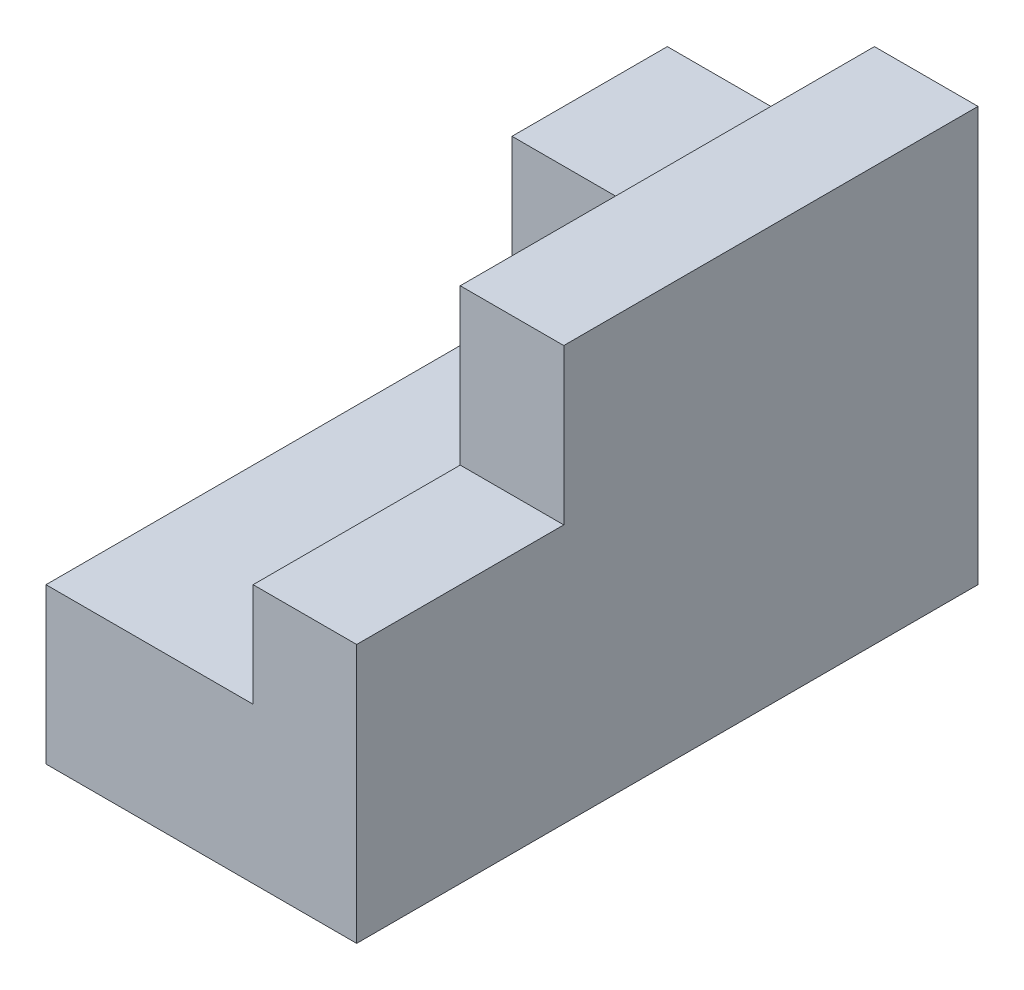
ISO-10303-21;
HEADER;
FILE_DESCRIPTION(('STEP AP214'),'2;1');
FILE_NAME('part.step','',(''),(''),'','','');
FILE_SCHEMA(('AUTOMOTIVE_DESIGN { 1 0 10303 214 1 1 1 1 }'));
ENDSEC;
DATA;
#1=APPLICATION_CONTEXT('core data for automotive mechanical design processes');
#2=APPLICATION_PROTOCOL_DEFINITION('international standard','automotive_design',2000,#1);
#3=PRODUCT_CONTEXT('',#1,'mechanical');
#4=PRODUCT('Part','Part','',(#3));
#5=PRODUCT_RELATED_PRODUCT_CATEGORY('part','',(#4));
#6=PRODUCT_DEFINITION_FORMATION('','',#4);
#7=PRODUCT_DEFINITION_CONTEXT('part definition',#1,'design');
#8=PRODUCT_DEFINITION('design','',#6,#7);
#9=PRODUCT_DEFINITION_SHAPE('','',#8);
#10=(LENGTH_UNIT() NAMED_UNIT(*) SI_UNIT(.MILLI.,.METRE.));
#11=(NAMED_UNIT(*) PLANE_ANGLE_UNIT() SI_UNIT($,.RADIAN.));
#12=(NAMED_UNIT(*) SI_UNIT($,.STERADIAN.) SOLID_ANGLE_UNIT());
#13=UNCERTAINTY_MEASURE_WITH_UNIT(LENGTH_MEASURE(1.E-05),#10,'distance_accuracy_value','');
#14=(GEOMETRIC_REPRESENTATION_CONTEXT(3) GLOBAL_UNCERTAINTY_ASSIGNED_CONTEXT((#13)) GLOBAL_UNIT_ASSIGNED_CONTEXT((#10,
#11,#12)) REPRESENTATION_CONTEXT('',''));
#15=CARTESIAN_POINT('',(0.,0.,0.));
#16=DIRECTION('',(0.,0.,1.));
#17=DIRECTION('',(1.,0.,0.));
#18=AXIS2_PLACEMENT_3D('',#15,#16,#17);
#19=CARTESIAN_POINT('',(0.,30.,15.));
#20=DIRECTION('',(0.,1.,0.));
#21=DIRECTION('',(0.,0.,1.));
#22=AXIS2_PLACEMENT_3D('',#19,#20,#21);
#23=PLANE('',#22);
#24=DIRECTION('',(1.,0.,0.));
#25=VECTOR('',#24,1.);
#26=CARTESIAN_POINT('',(0.,30.,0.));
#27=LINE('',#26,#25);
#28=CARTESIAN_POINT('',(-30.,30.,0.));
#29=VERTEX_POINT('',#28);
#30=CARTESIAN_POINT('',(-9.99999999999999,30.,0.));
#31=VERTEX_POINT('',#30);
#32=EDGE_CURVE('E173',#29,#31,#27,.T.);
#33=ORIENTED_EDGE('',*,*,#32,.F.);
#34=DIRECTION('',(0.,0.,-1.));
#35=VECTOR('',#34,1.);
#36=CARTESIAN_POINT('',(-30.,30.,15.));
#37=LINE('',#36,#35);
#38=CARTESIAN_POINT('',(-30.,30.,15.));
#39=VERTEX_POINT('',#38);
#40=EDGE_CURVE('E42',#39,#29,#37,.T.);
#41=ORIENTED_EDGE('',*,*,#40,.F.);
#42=DIRECTION('',(1.,0.,0.));
#43=VECTOR('',#42,1.);
#44=CARTESIAN_POINT('',(0.,30.,15.));
#45=LINE('',#44,#43);
#46=CARTESIAN_POINT('',(-9.99999999999999,30.,15.));
#47=VERTEX_POINT('',#46);
#48=EDGE_CURVE('E179',#39,#47,#45,.T.);
#49=ORIENTED_EDGE('',*,*,#48,.T.);
#50=DIRECTION('',(0.,0.,-1.));
#51=VECTOR('',#50,1.);
#52=CARTESIAN_POINT('',(-9.99999999999999,30.,15.));
#53=LINE('',#52,#51);
#54=EDGE_CURVE('E11',#47,#31,#53,.T.);
#55=ORIENTED_EDGE('',*,*,#54,.T.);
#56=EDGE_LOOP('',(#33,#41,#49,#55));
#57=FACE_BOUND('',#56,.T.);
#58=ADVANCED_FACE('F35',(#57),#23,.T.);
#59=CARTESIAN_POINT('',(-30.,0.,15.));
#60=DIRECTION('',(-1.,0.,0.));
#61=DIRECTION('',(0.,0.,1.));
#62=AXIS2_PLACEMENT_3D('',#59,#60,#61);
#63=PLANE('',#62);
#64=DIRECTION('',(0.,1.,0.));
#65=VECTOR('',#64,1.);
#66=CARTESIAN_POINT('',(-30.,0.,0.));
#67=LINE('',#66,#65);
#68=CARTESIAN_POINT('',(-30.,0.,0.));
#69=VERTEX_POINT('',#68);
#70=EDGE_CURVE('E177',#69,#29,#67,.T.);
#71=ORIENTED_EDGE('',*,*,#70,.F.);
#72=DIRECTION('',(0.,0.,-1.));
#73=VECTOR('',#72,1.);
#74=CARTESIAN_POINT('',(-30.,0.,60.));
#75=LINE('',#74,#73);
#76=CARTESIAN_POINT('',(-30.,0.,60.));
#77=VERTEX_POINT('',#76);
#78=EDGE_CURVE('E162',#77,#69,#75,.T.);
#79=ORIENTED_EDGE('',*,*,#78,.F.);
#80=DIRECTION('',(0.,1.,0.));
#81=VECTOR('',#80,1.);
#82=CARTESIAN_POINT('',(-30.,0.,60.));
#83=LINE('',#82,#81);
#84=CARTESIAN_POINT('',(-30.,15.,60.));
#85=VERTEX_POINT('',#84);
#86=EDGE_CURVE('E147',#77,#85,#83,.T.);
#87=ORIENTED_EDGE('',*,*,#86,.T.);
#88=DIRECTION('',(0.,0.,-1.));
#89=VECTOR('',#88,1.);
#90=CARTESIAN_POINT('',(-30.,15.,60.));
#91=LINE('',#90,#89);
#92=CARTESIAN_POINT('',(-30.,15.,15.));
#93=VERTEX_POINT('',#92);
#94=EDGE_CURVE('E165',#85,#93,#91,.T.);
#95=ORIENTED_EDGE('',*,*,#94,.T.);
#96=DIRECTION('',(0.,1.,0.));
#97=VECTOR('',#96,1.);
#98=CARTESIAN_POINT('',(-30.,0.,15.));
#99=LINE('',#98,#97);
#100=EDGE_CURVE('E182',#93,#39,#99,.T.);
#101=ORIENTED_EDGE('',*,*,#100,.T.);
#102=ORIENTED_EDGE('',*,*,#40,.T.);
#103=EDGE_LOOP('',(#71,#79,#87,#95,#101,#102));
#104=FACE_BOUND('',#103,.T.);
#105=ADVANCED_FACE('F190',(#104),#63,.T.);
#106=CARTESIAN_POINT('',(0.,0.,15.));
#107=DIRECTION('',(0.,0.,1.));
#108=DIRECTION('',(1.,0.,0.));
#109=AXIS2_PLACEMENT_3D('',#106,#107,#108);
#110=PLANE('',#109);
#111=DIRECTION('',(1.,0.,0.));
#112=VECTOR('',#111,1.);
#113=CARTESIAN_POINT('',(0.,15.,15.));
#114=LINE('',#113,#112);
#115=CARTESIAN_POINT('',(-9.99999999999999,15.,15.));
#116=VERTEX_POINT('',#115);
#117=EDGE_CURVE('E174',#93,#116,#114,.T.);
#118=ORIENTED_EDGE('',*,*,#117,.T.);
#119=DIRECTION('',(0.,1.,0.));
#120=VECTOR('',#119,1.);
#121=CARTESIAN_POINT('',(-9.99999999999999,0.,15.));
#122=LINE('',#121,#120);
#123=EDGE_CURVE('E176',#116,#47,#122,.T.);
#124=ORIENTED_EDGE('',*,*,#123,.T.);
#125=ORIENTED_EDGE('',*,*,#48,.F.);
#126=ORIENTED_EDGE('',*,*,#100,.F.);
#127=EDGE_LOOP('',(#118,#124,#125,#126));
#128=FACE_BOUND('',#127,.T.);
#129=ADVANCED_FACE('F213',(#128),#110,.T.);
#130=CARTESIAN_POINT('',(0.,0.,0.));
#131=DIRECTION('',(0.,0.,1.));
#132=DIRECTION('',(1.,0.,0.));
#133=AXIS2_PLACEMENT_3D('',#130,#131,#132);
#134=PLANE('',#133);
#135=ORIENTED_EDGE('',*,*,#32,.T.);
#136=DIRECTION('',(0.,1.,0.));
#137=VECTOR('',#136,1.);
#138=CARTESIAN_POINT('',(-9.99999999999999,0.,0.));
#139=LINE('',#138,#137);
#140=CARTESIAN_POINT('',(-9.99999999999999,40.,0.));
#141=VERTEX_POINT('',#140);
#142=EDGE_CURVE('E134',#31,#141,#139,.T.);
#143=ORIENTED_EDGE('',*,*,#142,.T.);
#144=DIRECTION('',(1.,0.,0.));
#145=VECTOR('',#144,1.);
#146=CARTESIAN_POINT('',(0.,40.,0.));
#147=LINE('',#146,#145);
#148=CARTESIAN_POINT('',(0.,40.,0.));
#149=VERTEX_POINT('',#148);
#150=EDGE_CURVE('E136',#141,#149,#147,.T.);
#151=ORIENTED_EDGE('',*,*,#150,.T.);
#152=DIRECTION('',(0.,-1.,0.));
#153=VECTOR('',#152,1.);
#154=CARTESIAN_POINT('',(0.,0.,0.));
#155=LINE('',#154,#153);
#156=CARTESIAN_POINT('',(0.,0.,0.));
#157=VERTEX_POINT('',#156);
#158=EDGE_CURVE('E113',#149,#157,#155,.T.);
#159=ORIENTED_EDGE('',*,*,#158,.T.);
#160=DIRECTION('',(-1.,0.,0.));
#161=VECTOR('',#160,1.);
#162=CARTESIAN_POINT('',(0.,0.,0.));
#163=LINE('',#162,#161);
#164=EDGE_CURVE('E118',#157,#69,#163,.T.);
#165=ORIENTED_EDGE('',*,*,#164,.T.);
#166=ORIENTED_EDGE('',*,*,#70,.T.);
#167=EDGE_LOOP('',(#135,#143,#151,#159,#165,#166));
#168=FACE_BOUND('',#167,.T.);
#169=ADVANCED_FACE('F196',(#168),#134,.F.);
#170=CARTESIAN_POINT('',(0.,25.,60.));
#171=DIRECTION('',(0.,1.,0.));
#172=DIRECTION('',(0.,0.,1.));
#173=AXIS2_PLACEMENT_3D('',#170,#171,#172);
#174=PLANE('',#173);
#175=DIRECTION('',(1.,0.,0.));
#176=VECTOR('',#175,1.);
#177=CARTESIAN_POINT('',(0.,25.,40.));
#178=LINE('',#177,#176);
#179=CARTESIAN_POINT('',(-9.99999999999999,25.,40.));
#180=VERTEX_POINT('',#179);
#181=CARTESIAN_POINT('',(0.,25.,40.));
#182=VERTEX_POINT('',#181);
#183=EDGE_CURVE('E49',#180,#182,#178,.T.);
#184=ORIENTED_EDGE('',*,*,#183,.F.);
#185=DIRECTION('',(0.,0.,-1.));
#186=VECTOR('',#185,1.);
#187=CARTESIAN_POINT('',(-9.99999999999999,25.,60.));
#188=LINE('',#187,#186);
#189=CARTESIAN_POINT('',(-9.99999999999999,25.,60.));
#190=VERTEX_POINT('',#189);
#191=EDGE_CURVE('E171',#190,#180,#188,.T.);
#192=ORIENTED_EDGE('',*,*,#191,.F.);
#193=DIRECTION('',(1.,0.,0.));
#194=VECTOR('',#193,1.);
#195=CARTESIAN_POINT('',(0.,25.,60.));
#196=LINE('',#195,#194);
#197=CARTESIAN_POINT('',(0.,25.,60.));
#198=VERTEX_POINT('',#197);
#199=EDGE_CURVE('E139',#190,#198,#196,.T.);
#200=ORIENTED_EDGE('',*,*,#199,.T.);
#201=DIRECTION('',(0.,0.,-1.));
#202=VECTOR('',#201,1.);
#203=CARTESIAN_POINT('',(0.,25.,60.));
#204=LINE('',#203,#202);
#205=EDGE_CURVE('E54',#198,#182,#204,.T.);
#206=ORIENTED_EDGE('',*,*,#205,.T.);
#207=EDGE_LOOP('',(#184,#192,#200,#206));
#208=FACE_BOUND('',#207,.T.);
#209=ADVANCED_FACE('F217',(#208),#174,.T.);
#210=CARTESIAN_POINT('',(-9.99999999999999,0.,60.));
#211=DIRECTION('',(-1.,0.,0.));
#212=DIRECTION('',(0.,0.,1.));
#213=AXIS2_PLACEMENT_3D('',#210,#211,#212);
#214=PLANE('',#213);
#215=ORIENTED_EDGE('',*,*,#191,.T.);
#216=DIRECTION('',(0.,1.,0.));
#217=VECTOR('',#216,1.);
#218=CARTESIAN_POINT('',(-9.99999999999999,0.,40.));
#219=LINE('',#218,#217);
#220=CARTESIAN_POINT('',(-9.99999999999999,40.,40.));
#221=VERTEX_POINT('',#220);
#222=EDGE_CURVE('E137',#180,#221,#219,.T.);
#223=ORIENTED_EDGE('',*,*,#222,.T.);
#224=DIRECTION('',(0.,0.,-1.));
#225=VECTOR('',#224,1.);
#226=CARTESIAN_POINT('',(-9.99999999999999,40.,40.));
#227=LINE('',#226,#225);
#228=EDGE_CURVE('E119',#221,#141,#227,.T.);
#229=ORIENTED_EDGE('',*,*,#228,.T.);
#230=ORIENTED_EDGE('',*,*,#142,.F.);
#231=ORIENTED_EDGE('',*,*,#54,.F.);
#232=ORIENTED_EDGE('',*,*,#123,.F.);
#233=DIRECTION('',(0.,0.,-1.));
#234=VECTOR('',#233,1.);
#235=CARTESIAN_POINT('',(-9.99999999999999,15.,60.));
#236=LINE('',#235,#234);
#237=CARTESIAN_POINT('',(-9.99999999999999,15.,60.));
#238=VERTEX_POINT('',#237);
#239=EDGE_CURVE('E168',#238,#116,#236,.T.);
#240=ORIENTED_EDGE('',*,*,#239,.F.);
#241=DIRECTION('',(0.,1.,0.));
#242=VECTOR('',#241,1.);
#243=CARTESIAN_POINT('',(-9.99999999999999,0.,60.));
#244=LINE('',#243,#242);
#245=EDGE_CURVE('E141',#238,#190,#244,.T.);
#246=ORIENTED_EDGE('',*,*,#245,.T.);
#247=EDGE_LOOP('',(#215,#223,#229,#230,#231,#232,#240,#246));
#248=FACE_BOUND('',#247,.T.);
#249=ADVANCED_FACE('F215',(#248),#214,.T.);
#250=CARTESIAN_POINT('',(0.,15.,60.));
#251=DIRECTION('',(0.,1.,0.));
#252=DIRECTION('',(0.,0.,1.));
#253=AXIS2_PLACEMENT_3D('',#250,#251,#252);
#254=PLANE('',#253);
#255=ORIENTED_EDGE('',*,*,#239,.T.);
#256=ORIENTED_EDGE('',*,*,#117,.F.);
#257=ORIENTED_EDGE('',*,*,#94,.F.);
#258=DIRECTION('',(1.,0.,0.));
#259=VECTOR('',#258,1.);
#260=CARTESIAN_POINT('',(0.,15.,60.));
#261=LINE('',#260,#259);
#262=EDGE_CURVE('E144',#85,#238,#261,.T.);
#263=ORIENTED_EDGE('',*,*,#262,.T.);
#264=EDGE_LOOP('',(#255,#256,#257,#263));
#265=FACE_BOUND('',#264,.T.);
#266=ADVANCED_FACE('F209',(#265),#254,.T.);
#267=CARTESIAN_POINT('',(0.,0.,60.));
#268=DIRECTION('',(0.,-1.,0.));
#269=DIRECTION('',(0.,0.,-1.));
#270=AXIS2_PLACEMENT_3D('',#267,#268,#269);
#271=PLANE('',#270);
#272=ORIENTED_EDGE('',*,*,#164,.F.);
#273=DIRECTION('',(0.,0.,-1.));
#274=VECTOR('',#273,1.);
#275=CARTESIAN_POINT('',(0.,0.,60.));
#276=LINE('',#275,#274);
#277=CARTESIAN_POINT('',(0.,0.,60.));
#278=VERTEX_POINT('',#277);
#279=EDGE_CURVE('E160',#278,#157,#276,.T.);
#280=ORIENTED_EDGE('',*,*,#279,.F.);
#281=DIRECTION('',(-1.,0.,0.));
#282=VECTOR('',#281,1.);
#283=CARTESIAN_POINT('',(0.,0.,60.));
#284=LINE('',#283,#282);
#285=EDGE_CURVE('E150',#278,#77,#284,.T.);
#286=ORIENTED_EDGE('',*,*,#285,.T.);
#287=ORIENTED_EDGE('',*,*,#78,.T.);
#288=EDGE_LOOP('',(#272,#280,#286,#287));
#289=FACE_BOUND('',#288,.T.);
#290=ADVANCED_FACE('F199',(#289),#271,.T.);
#291=CARTESIAN_POINT('',(0.,0.,60.));
#292=DIRECTION('',(1.,0.,0.));
#293=DIRECTION('',(0.,1.,0.));
#294=AXIS2_PLACEMENT_3D('',#291,#292,#293);
#295=PLANE('',#294);
#296=ORIENTED_EDGE('',*,*,#158,.F.);
#297=DIRECTION('',(0.,0.,-1.));
#298=VECTOR('',#297,1.);
#299=CARTESIAN_POINT('',(0.,40.,40.));
#300=LINE('',#299,#298);
#301=CARTESIAN_POINT('',(0.,40.,40.));
#302=VERTEX_POINT('',#301);
#303=EDGE_CURVE('E108',#302,#149,#300,.T.);
#304=ORIENTED_EDGE('',*,*,#303,.F.);
#305=DIRECTION('',(0.,-1.,0.));
#306=VECTOR('',#305,1.);
#307=CARTESIAN_POINT('',(0.,0.,40.));
#308=LINE('',#307,#306);
#309=EDGE_CURVE('E111',#302,#182,#308,.T.);
#310=ORIENTED_EDGE('',*,*,#309,.T.);
#311=ORIENTED_EDGE('',*,*,#205,.F.);
#312=DIRECTION('',(0.,-1.,0.));
#313=VECTOR('',#312,1.);
#314=CARTESIAN_POINT('',(0.,0.,60.));
#315=LINE('',#314,#313);
#316=EDGE_CURVE('E153',#198,#278,#315,.T.);
#317=ORIENTED_EDGE('',*,*,#316,.T.);
#318=ORIENTED_EDGE('',*,*,#279,.T.);
#319=EDGE_LOOP('',(#296,#304,#310,#311,#317,#318));
#320=FACE_BOUND('',#319,.T.);
#321=ADVANCED_FACE('F110',(#320),#295,.T.);
#322=CARTESIAN_POINT('',(0.,0.,60.));
#323=DIRECTION('',(0.,0.,1.));
#324=DIRECTION('',(1.,0.,0.));
#325=AXIS2_PLACEMENT_3D('',#322,#323,#324);
#326=PLANE('',#325);
#327=ORIENTED_EDGE('',*,*,#199,.F.);
#328=ORIENTED_EDGE('',*,*,#245,.F.);
#329=ORIENTED_EDGE('',*,*,#262,.F.);
#330=ORIENTED_EDGE('',*,*,#86,.F.);
#331=ORIENTED_EDGE('',*,*,#285,.F.);
#332=ORIENTED_EDGE('',*,*,#316,.F.);
#333=EDGE_LOOP('',(#327,#328,#329,#330,#331,#332));
#334=FACE_BOUND('',#333,.T.);
#335=ADVANCED_FACE('F205',(#334),#326,.T.);
#336=CARTESIAN_POINT('',(0.,40.,40.));
#337=DIRECTION('',(0.,1.,0.));
#338=DIRECTION('',(-1.,0.,0.));
#339=AXIS2_PLACEMENT_3D('',#336,#337,#338);
#340=PLANE('',#339);
#341=ORIENTED_EDGE('',*,*,#150,.F.);
#342=ORIENTED_EDGE('',*,*,#228,.F.);
#343=DIRECTION('',(1.,0.,0.));
#344=VECTOR('',#343,1.);
#345=CARTESIAN_POINT('',(0.,40.,40.));
#346=LINE('',#345,#344);
#347=EDGE_CURVE('E125',#221,#302,#346,.T.);
#348=ORIENTED_EDGE('',*,*,#347,.T.);
#349=ORIENTED_EDGE('',*,*,#303,.T.);
#350=EDGE_LOOP('',(#341,#342,#348,#349));
#351=FACE_BOUND('',#350,.T.);
#352=ADVANCED_FACE('F127',(#351),#340,.T.);
#353=CARTESIAN_POINT('',(0.,0.,40.));
#354=DIRECTION('',(0.,0.,1.));
#355=DIRECTION('',(1.,0.,0.));
#356=AXIS2_PLACEMENT_3D('',#353,#354,#355);
#357=PLANE('',#356);
#358=ORIENTED_EDGE('',*,*,#222,.F.);
#359=ORIENTED_EDGE('',*,*,#183,.T.);
#360=ORIENTED_EDGE('',*,*,#309,.F.);
#361=ORIENTED_EDGE('',*,*,#347,.F.);
#362=EDGE_LOOP('',(#358,#359,#360,#361));
#363=FACE_BOUND('',#362,.T.);
#364=ADVANCED_FACE('F124',(#363),#357,.T.);
#365=CLOSED_SHELL('',(#58,#105,#129,#169,#209,#249,#266,#290,#321,#335,#352,#364));
#366=MANIFOLD_SOLID_BREP('B2',#365);
#367=ADVANCED_BREP_SHAPE_REPRESENTATION('',(#18,#366),#14);
#368=SHAPE_DEFINITION_REPRESENTATION(#9,#367);
ENDSEC;
END-ISO-10303-21;
